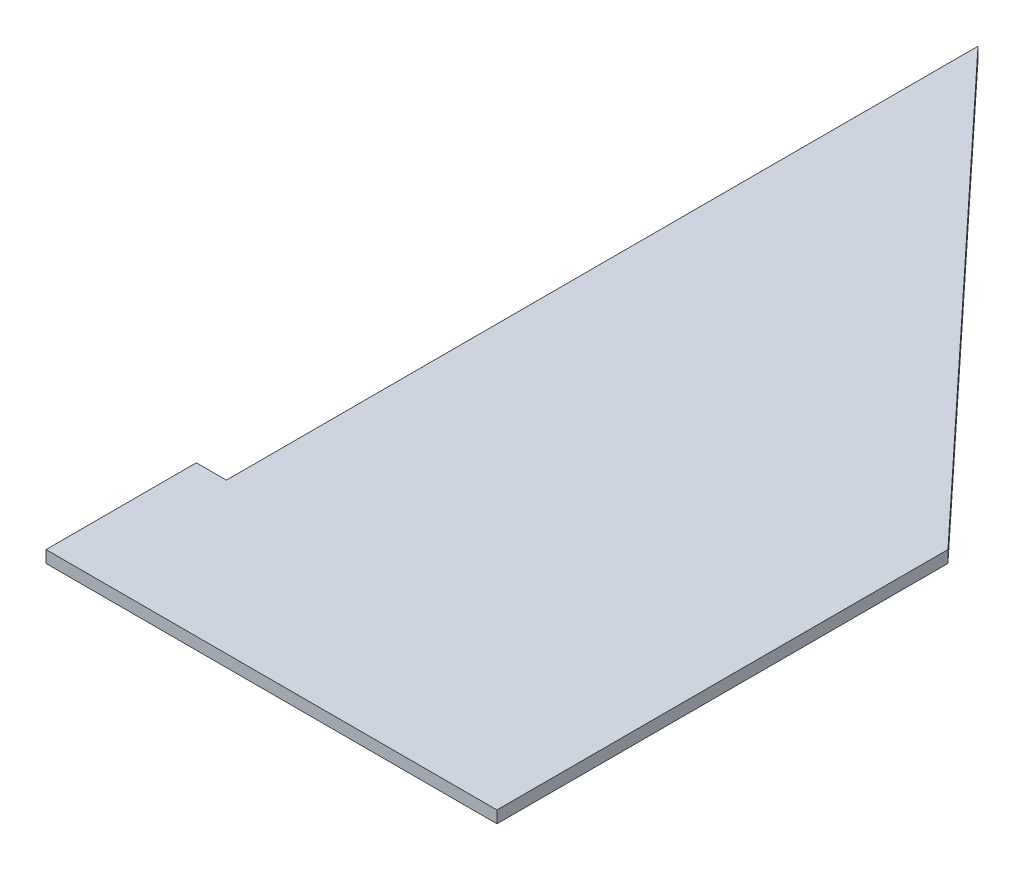
ISO-10303-21;
HEADER;
FILE_DESCRIPTION(('STEP AP214'),'2;1');
FILE_NAME('part.step','',(''),(''),'','','');
FILE_SCHEMA(('AUTOMOTIVE_DESIGN { 1 0 10303 214 1 1 1 1 }'));
ENDSEC;
DATA;
#1=APPLICATION_CONTEXT('core data for automotive mechanical design processes');
#2=APPLICATION_PROTOCOL_DEFINITION('international standard','automotive_design',2000,#1);
#3=PRODUCT_CONTEXT('',#1,'mechanical');
#4=PRODUCT('Part','Part','',(#3));
#5=PRODUCT_RELATED_PRODUCT_CATEGORY('part','',(#4));
#6=PRODUCT_DEFINITION_FORMATION('','',#4);
#7=PRODUCT_DEFINITION_CONTEXT('part definition',#1,'design');
#8=PRODUCT_DEFINITION('design','',#6,#7);
#9=PRODUCT_DEFINITION_SHAPE('','',#8);
#10=(LENGTH_UNIT() NAMED_UNIT(*) SI_UNIT(.MILLI.,.METRE.));
#11=(NAMED_UNIT(*) PLANE_ANGLE_UNIT() SI_UNIT($,.RADIAN.));
#12=(NAMED_UNIT(*) SI_UNIT($,.STERADIAN.) SOLID_ANGLE_UNIT());
#13=UNCERTAINTY_MEASURE_WITH_UNIT(LENGTH_MEASURE(1.E-05),#10,'distance_accuracy_value','');
#14=(GEOMETRIC_REPRESENTATION_CONTEXT(3) GLOBAL_UNCERTAINTY_ASSIGNED_CONTEXT((#13)) GLOBAL_UNIT_ASSIGNED_CONTEXT((#10,
#11,#12)) REPRESENTATION_CONTEXT('',''));
#15=CARTESIAN_POINT('',(0.,0.,0.));
#16=DIRECTION('',(0.,0.,1.));
#17=DIRECTION('',(1.,0.,0.));
#18=AXIS2_PLACEMENT_3D('',#15,#16,#17);
#19=CARTESIAN_POINT('',(140.,-2.,-150.));
#20=DIRECTION('',(0.731055268242869,0.,-0.682318250360011));
#21=DIRECTION('',(-0.682318250360011,0.,-0.731055268242869));
#22=AXIS2_PLACEMENT_3D('',#19,#20,#21);
#23=PLANE('',#22);
#24=DIRECTION('',(0.,1.,0.));
#25=VECTOR('',#24,1.);
#26=CARTESIAN_POINT('',(0.,-2.,-300.));
#27=LINE('',#26,#25);
#28=CARTESIAN_POINT('',(0.,-2.,-300.));
#29=VERTEX_POINT('',#28);
#30=CARTESIAN_POINT('',(0.,2.,-300.));
#31=VERTEX_POINT('',#30);
#32=EDGE_CURVE('E38',#29,#31,#27,.T.);
#33=ORIENTED_EDGE('',*,*,#32,.T.);
#34=DIRECTION('',(-0.682318250360011,0.,-0.731055268242869));
#35=VECTOR('',#34,1.);
#36=CARTESIAN_POINT('',(140.,2.,-150.));
#37=LINE('',#36,#35);
#38=CARTESIAN_POINT('',(140.,2.,-150.));
#39=VERTEX_POINT('',#38);
#40=EDGE_CURVE('E87',#39,#31,#37,.T.);
#41=ORIENTED_EDGE('',*,*,#40,.F.);
#42=DIRECTION('',(0.,1.,0.));
#43=VECTOR('',#42,1.);
#44=CARTESIAN_POINT('',(140.,-2.,-150.));
#45=LINE('',#44,#43);
#46=CARTESIAN_POINT('',(140.,-2.,-150.));
#47=VERTEX_POINT('',#46);
#48=EDGE_CURVE('E11',#47,#39,#45,.T.);
#49=ORIENTED_EDGE('',*,*,#48,.F.);
#50=DIRECTION('',(-0.682318250360011,0.,-0.731055268242869));
#51=VECTOR('',#50,1.);
#52=CARTESIAN_POINT('',(140.,-2.,-150.));
#53=LINE('',#52,#51);
#54=EDGE_CURVE('E88',#47,#29,#53,.T.);
#55=ORIENTED_EDGE('',*,*,#54,.T.);
#56=EDGE_LOOP('',(#33,#41,#49,#55));
#57=FACE_BOUND('',#56,.T.);
#58=ADVANCED_FACE('F35',(#57),#23,.T.);
#59=CARTESIAN_POINT('',(140.,-2.,0.));
#60=DIRECTION('',(1.,0.,0.));
#61=DIRECTION('',(0.,0.,-1.));
#62=AXIS2_PLACEMENT_3D('',#59,#60,#61);
#63=PLANE('',#62);
#64=ORIENTED_EDGE('',*,*,#48,.T.);
#65=DIRECTION('',(0.,0.,-1.));
#66=VECTOR('',#65,1.);
#67=CARTESIAN_POINT('',(140.,2.,0.));
#68=LINE('',#67,#66);
#69=CARTESIAN_POINT('',(140.,2.,0.));
#70=VERTEX_POINT('',#69);
#71=EDGE_CURVE('E106',#70,#39,#68,.T.);
#72=ORIENTED_EDGE('',*,*,#71,.F.);
#73=DIRECTION('',(0.,1.,0.));
#74=VECTOR('',#73,1.);
#75=CARTESIAN_POINT('',(140.,-2.,0.));
#76=LINE('',#75,#74);
#77=CARTESIAN_POINT('',(140.,-2.,0.));
#78=VERTEX_POINT('',#77);
#79=EDGE_CURVE('E43',#78,#70,#76,.T.);
#80=ORIENTED_EDGE('',*,*,#79,.F.);
#81=DIRECTION('',(0.,0.,-1.));
#82=VECTOR('',#81,1.);
#83=CARTESIAN_POINT('',(140.,-2.,0.));
#84=LINE('',#83,#82);
#85=EDGE_CURVE('E93',#78,#47,#84,.T.);
#86=ORIENTED_EDGE('',*,*,#85,.T.);
#87=EDGE_LOOP('',(#64,#72,#80,#86));
#88=FACE_BOUND('',#87,.T.);
#89=ADVANCED_FACE('F145',(#88),#63,.T.);
#90=CARTESIAN_POINT('',(0.,-2.,0.));
#91=DIRECTION('',(0.,0.,1.));
#92=DIRECTION('',(1.,0.,0.));
#93=AXIS2_PLACEMENT_3D('',#90,#91,#92);
#94=PLANE('',#93);
#95=ORIENTED_EDGE('',*,*,#79,.T.);
#96=DIRECTION('',(1.,0.,0.));
#97=VECTOR('',#96,1.);
#98=CARTESIAN_POINT('',(0.,2.,0.));
#99=LINE('',#98,#97);
#100=CARTESIAN_POINT('',(-9.99999999999979,2.,0.));
#101=VERTEX_POINT('',#100);
#102=EDGE_CURVE('E113',#101,#70,#99,.T.);
#103=ORIENTED_EDGE('',*,*,#102,.F.);
#104=DIRECTION('',(0.,1.,0.));
#105=VECTOR('',#104,1.);
#106=CARTESIAN_POINT('',(-9.99999999999979,-2.,0.));
#107=LINE('',#106,#105);
#108=CARTESIAN_POINT('',(-9.99999999999979,-2.,0.));
#109=VERTEX_POINT('',#108);
#110=EDGE_CURVE('E129',#109,#101,#107,.T.);
#111=ORIENTED_EDGE('',*,*,#110,.F.);
#112=DIRECTION('',(1.,0.,0.));
#113=VECTOR('',#112,1.);
#114=CARTESIAN_POINT('',(0.,-2.,0.));
#115=LINE('',#114,#113);
#116=EDGE_CURVE('E57',#109,#78,#115,.T.);
#117=ORIENTED_EDGE('',*,*,#116,.T.);
#118=EDGE_LOOP('',(#95,#103,#111,#117));
#119=FACE_BOUND('',#118,.T.);
#120=ADVANCED_FACE('F140',(#119),#94,.T.);
#121=CARTESIAN_POINT('',(-9.99999999999979,-2.,0.));
#122=DIRECTION('',(-1.,0.,0.));
#123=DIRECTION('',(0.,0.,1.));
#124=AXIS2_PLACEMENT_3D('',#121,#122,#123);
#125=PLANE('',#124);
#126=ORIENTED_EDGE('',*,*,#110,.T.);
#127=DIRECTION('',(0.,0.,1.));
#128=VECTOR('',#127,1.);
#129=CARTESIAN_POINT('',(-9.99999999999979,2.,0.));
#130=LINE('',#129,#128);
#131=CARTESIAN_POINT('',(-9.99999999999979,2.,-50.));
#132=VERTEX_POINT('',#131);
#133=EDGE_CURVE('E110',#132,#101,#130,.T.);
#134=ORIENTED_EDGE('',*,*,#133,.F.);
#135=DIRECTION('',(0.,1.,0.));
#136=VECTOR('',#135,1.);
#137=CARTESIAN_POINT('',(-9.99999999999979,-2.,-50.));
#138=LINE('',#137,#136);
#139=CARTESIAN_POINT('',(-9.99999999999979,-2.,-50.));
#140=VERTEX_POINT('',#139);
#141=EDGE_CURVE('E131',#140,#132,#138,.T.);
#142=ORIENTED_EDGE('',*,*,#141,.F.);
#143=DIRECTION('',(0.,0.,1.));
#144=VECTOR('',#143,1.);
#145=CARTESIAN_POINT('',(-9.99999999999979,-2.,0.));
#146=LINE('',#145,#144);
#147=EDGE_CURVE('E122',#140,#109,#146,.T.);
#148=ORIENTED_EDGE('',*,*,#147,.T.);
#149=EDGE_LOOP('',(#126,#134,#142,#148));
#150=FACE_BOUND('',#149,.T.);
#151=ADVANCED_FACE('F139',(#150),#125,.T.);
#152=CARTESIAN_POINT('',(-9.99999999999979,-2.,-50.));
#153=DIRECTION('',(0.,0.,-1.));
#154=DIRECTION('',(-1.,0.,0.));
#155=AXIS2_PLACEMENT_3D('',#152,#153,#154);
#156=PLANE('',#155);
#157=ORIENTED_EDGE('',*,*,#141,.T.);
#158=DIRECTION('',(-1.,0.,0.));
#159=VECTOR('',#158,1.);
#160=CARTESIAN_POINT('',(-9.99999999999979,2.,-50.));
#161=LINE('',#160,#159);
#162=CARTESIAN_POINT('',(0.,2.,-50.));
#163=VERTEX_POINT('',#162);
#164=EDGE_CURVE('E100',#163,#132,#161,.T.);
#165=ORIENTED_EDGE('',*,*,#164,.F.);
#166=DIRECTION('',(0.,1.,0.));
#167=VECTOR('',#166,1.);
#168=CARTESIAN_POINT('',(0.,-2.,-50.));
#169=LINE('',#168,#167);
#170=CARTESIAN_POINT('',(0.,-2.,-50.));
#171=VERTEX_POINT('',#170);
#172=EDGE_CURVE('E92',#171,#163,#169,.T.);
#173=ORIENTED_EDGE('',*,*,#172,.F.);
#174=DIRECTION('',(-1.,0.,0.));
#175=VECTOR('',#174,1.);
#176=CARTESIAN_POINT('',(-9.99999999999979,-2.,-50.));
#177=LINE('',#176,#175);
#178=EDGE_CURVE('E119',#171,#140,#177,.T.);
#179=ORIENTED_EDGE('',*,*,#178,.T.);
#180=EDGE_LOOP('',(#157,#165,#173,#179));
#181=FACE_BOUND('',#180,.T.);
#182=ADVANCED_FACE('F133',(#181),#156,.T.);
#183=CARTESIAN_POINT('',(0.,-2.,-300.));
#184=DIRECTION('',(-1.,0.,0.));
#185=DIRECTION('',(0.,0.,1.));
#186=AXIS2_PLACEMENT_3D('',#183,#184,#185);
#187=PLANE('',#186);
#188=ORIENTED_EDGE('',*,*,#172,.T.);
#189=DIRECTION('',(0.,0.,1.));
#190=VECTOR('',#189,1.);
#191=CARTESIAN_POINT('',(0.,2.,-300.));
#192=LINE('',#191,#190);
#193=EDGE_CURVE('E95',#31,#163,#192,.T.);
#194=ORIENTED_EDGE('',*,*,#193,.F.);
#195=ORIENTED_EDGE('',*,*,#32,.F.);
#196=DIRECTION('',(0.,0.,1.));
#197=VECTOR('',#196,1.);
#198=CARTESIAN_POINT('',(0.,-2.,-300.));
#199=LINE('',#198,#197);
#200=EDGE_CURVE('E117',#29,#171,#199,.T.);
#201=ORIENTED_EDGE('',*,*,#200,.T.);
#202=EDGE_LOOP('',(#188,#194,#195,#201));
#203=FACE_BOUND('',#202,.T.);
#204=ADVANCED_FACE('F96',(#203),#187,.T.);
#205=CARTESIAN_POINT('',(0.,-2.,0.));
#206=DIRECTION('',(0.,-1.,0.));
#207=DIRECTION('',(0.,0.,-1.));
#208=AXIS2_PLACEMENT_3D('',#205,#206,#207);
#209=PLANE('',#208);
#210=ORIENTED_EDGE('',*,*,#54,.F.);
#211=ORIENTED_EDGE('',*,*,#85,.F.);
#212=ORIENTED_EDGE('',*,*,#116,.F.);
#213=ORIENTED_EDGE('',*,*,#147,.F.);
#214=ORIENTED_EDGE('',*,*,#178,.F.);
#215=ORIENTED_EDGE('',*,*,#200,.F.);
#216=EDGE_LOOP('',(#210,#211,#212,#213,#214,#215));
#217=FACE_BOUND('',#216,.T.);
#218=ADVANCED_FACE('F143',(#217),#209,.T.);
#219=CARTESIAN_POINT('',(0.,2.,0.));
#220=DIRECTION('',(0.,-1.,0.));
#221=DIRECTION('',(0.,0.,-1.));
#222=AXIS2_PLACEMENT_3D('',#219,#220,#221);
#223=PLANE('',#222);
#224=ORIENTED_EDGE('',*,*,#40,.T.);
#225=ORIENTED_EDGE('',*,*,#193,.T.);
#226=ORIENTED_EDGE('',*,*,#164,.T.);
#227=ORIENTED_EDGE('',*,*,#133,.T.);
#228=ORIENTED_EDGE('',*,*,#102,.T.);
#229=ORIENTED_EDGE('',*,*,#71,.T.);
#230=EDGE_LOOP('',(#224,#225,#226,#227,#228,#229));
#231=FACE_BOUND('',#230,.T.);
#232=ADVANCED_FACE('F103',(#231),#223,.F.);
#233=CLOSED_SHELL('',(#58,#89,#120,#151,#182,#204,#218,#232));
#234=MANIFOLD_SOLID_BREP('B2',#233);
#235=ADVANCED_BREP_SHAPE_REPRESENTATION('',(#18,#234),#14);
#236=SHAPE_DEFINITION_REPRESENTATION(#9,#235);
ENDSEC;
END-ISO-10303-21;
